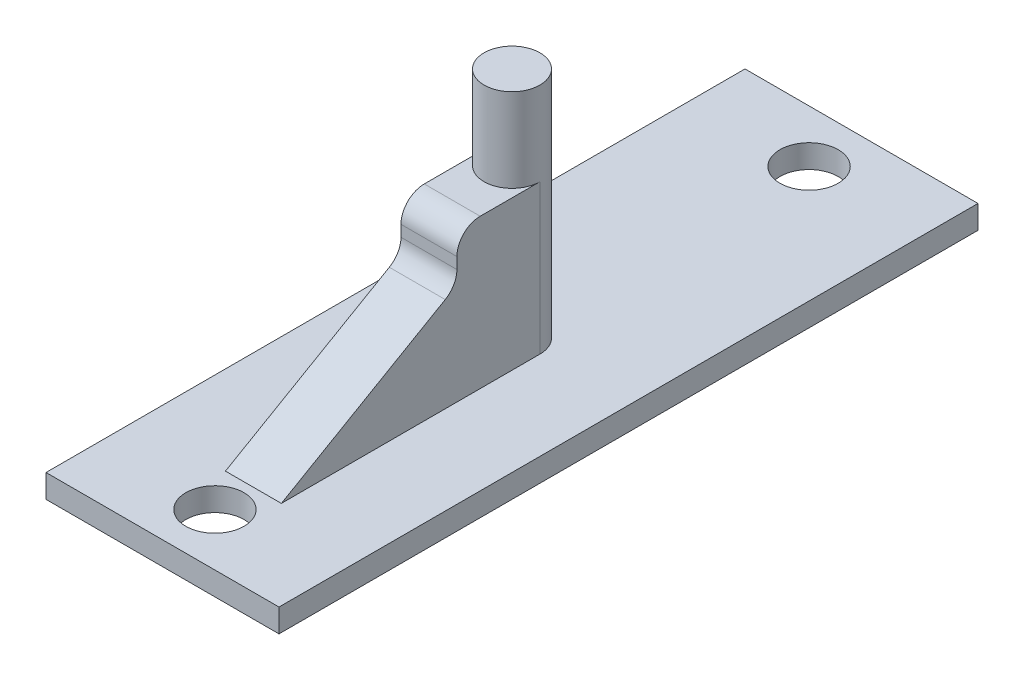
ISO-10303-21;
HEADER;
FILE_DESCRIPTION(('STEP AP214'),'2;1');
FILE_NAME('part.step','',(''),(''),'','','');
FILE_SCHEMA(('AUTOMOTIVE_DESIGN { 1 0 10303 214 1 1 1 1 }'));
ENDSEC;
DATA;
#1=APPLICATION_CONTEXT('core data for automotive mechanical design processes');
#2=APPLICATION_PROTOCOL_DEFINITION('international standard','automotive_design',2000,#1);
#3=PRODUCT_CONTEXT('',#1,'mechanical');
#4=PRODUCT('Part','Part','',(#3));
#5=PRODUCT_RELATED_PRODUCT_CATEGORY('part','',(#4));
#6=PRODUCT_DEFINITION_FORMATION('','',#4);
#7=PRODUCT_DEFINITION_CONTEXT('part definition',#1,'design');
#8=PRODUCT_DEFINITION('design','',#6,#7);
#9=PRODUCT_DEFINITION_SHAPE('','',#8);
#10=(LENGTH_UNIT() NAMED_UNIT(*) SI_UNIT(.MILLI.,.METRE.));
#11=(NAMED_UNIT(*) PLANE_ANGLE_UNIT() SI_UNIT($,.RADIAN.));
#12=(NAMED_UNIT(*) SI_UNIT($,.STERADIAN.) SOLID_ANGLE_UNIT());
#13=UNCERTAINTY_MEASURE_WITH_UNIT(LENGTH_MEASURE(1.E-05),#10,'distance_accuracy_value','');
#14=(GEOMETRIC_REPRESENTATION_CONTEXT(3) GLOBAL_UNCERTAINTY_ASSIGNED_CONTEXT((#13)) GLOBAL_UNIT_ASSIGNED_CONTEXT((#10,
#11,#12)) REPRESENTATION_CONTEXT('',''));
#15=CARTESIAN_POINT('',(0.,0.,0.));
#16=DIRECTION('',(0.,0.,1.));
#17=DIRECTION('',(1.,0.,0.));
#18=AXIS2_PLACEMENT_3D('',#15,#16,#17);
#19=CARTESIAN_POINT('',(0.,2.,0.));
#20=DIRECTION('',(0.,1.,0.));
#21=DIRECTION('',(0.,0.,1.));
#22=AXIS2_PLACEMENT_3D('',#19,#20,#21);
#23=PLANE('',#22);
#24=CARTESIAN_POINT('',(0.,2.,-25.5));
#25=DIRECTION('',(0.,1.,0.));
#26=DIRECTION('',(0.,0.,1.));
#27=AXIS2_PLACEMENT_3D('',#24,#25,#26);
#28=CIRCLE('',#27,2.5);
#29=CARTESIAN_POINT('',(0.,2.,-23.));
#30=VERTEX_POINT('',#29);
#31=EDGE_CURVE('E195',#30,#30,#28,.T.);
#32=ORIENTED_EDGE('',*,*,#31,.F.);
#33=EDGE_LOOP('',(#32));
#34=FACE_BOUND('',#33,.T.);
#35=CARTESIAN_POINT('',(0.,2.,25.5));
#36=DIRECTION('',(0.,1.,0.));
#37=DIRECTION('',(0.,0.,-1.));
#38=AXIS2_PLACEMENT_3D('',#35,#36,#37);
#39=CIRCLE('',#38,2.5);
#40=CARTESIAN_POINT('',(0.,2.,23.));
#41=VERTEX_POINT('',#40);
#42=EDGE_CURVE('E189',#41,#41,#39,.T.);
#43=ORIENTED_EDGE('',*,*,#42,.F.);
#44=EDGE_LOOP('',(#43));
#45=FACE_BOUND('',#44,.T.);
#46=DIRECTION('',(0.,0.,1.));
#47=VECTOR('',#46,1.);
#48=CARTESIAN_POINT('',(-10.,2.,-30.));
#49=LINE('',#48,#47);
#50=CARTESIAN_POINT('',(-10.,2.,-30.));
#51=VERTEX_POINT('',#50);
#52=CARTESIAN_POINT('',(-10.,2.,30.));
#53=VERTEX_POINT('',#52);
#54=EDGE_CURVE('E203',#51,#53,#49,.T.);
#55=ORIENTED_EDGE('',*,*,#54,.T.);
#56=DIRECTION('',(1.,0.,0.));
#57=VECTOR('',#56,1.);
#58=CARTESIAN_POINT('',(-10.,2.,30.));
#59=LINE('',#58,#57);
#60=CARTESIAN_POINT('',(10.,2.,30.));
#61=VERTEX_POINT('',#60);
#62=EDGE_CURVE('E206',#53,#61,#59,.T.);
#63=ORIENTED_EDGE('',*,*,#62,.T.);
#64=DIRECTION('',(0.,0.,-1.));
#65=VECTOR('',#64,1.);
#66=CARTESIAN_POINT('',(10.,2.,-30.));
#67=LINE('',#66,#65);
#68=CARTESIAN_POINT('',(10.,2.,-30.));
#69=VERTEX_POINT('',#68);
#70=EDGE_CURVE('E209',#61,#69,#67,.T.);
#71=ORIENTED_EDGE('',*,*,#70,.T.);
#72=DIRECTION('',(-1.,0.,0.));
#73=VECTOR('',#72,1.);
#74=CARTESIAN_POINT('',(-10.,2.,-30.));
#75=LINE('',#74,#73);
#76=EDGE_CURVE('E211',#69,#51,#75,.T.);
#77=ORIENTED_EDGE('',*,*,#76,.T.);
#78=EDGE_LOOP('',(#55,#63,#71,#77));
#79=FACE_BOUND('',#78,.T.);
#80=CARTESIAN_POINT('',(0.,2.,0.));
#81=DIRECTION('',(0.,1.,0.));
#82=DIRECTION('',(0.,0.,1.));
#83=AXIS2_PLACEMENT_3D('',#80,#81,#82);
#84=CIRCLE('',#83,2.4);
#85=CARTESIAN_POINT('',(2.4,2.,0.));
#86=VERTEX_POINT('',#85);
#87=CARTESIAN_POINT('',(-2.4,2.,0.));
#88=VERTEX_POINT('',#87);
#89=EDGE_CURVE('E181',#86,#88,#84,.T.);
#90=ORIENTED_EDGE('',*,*,#89,.F.);
#91=DIRECTION('',(0.,0.,1.));
#92=VECTOR('',#91,1.);
#93=CARTESIAN_POINT('',(2.4,2.,22.1964023040006));
#94=LINE('',#93,#92);
#95=CARTESIAN_POINT('',(2.4,2.,22.1964023040006));
#96=VERTEX_POINT('',#95);
#97=EDGE_CURVE('E62',#86,#96,#94,.T.);
#98=ORIENTED_EDGE('',*,*,#97,.T.);
#99=DIRECTION('',(-1.,0.,0.));
#100=VECTOR('',#99,1.);
#101=CARTESIAN_POINT('',(2.4,2.,22.1964023040006));
#102=LINE('',#101,#100);
#103=CARTESIAN_POINT('',(-2.4,2.,22.1964023040006));
#104=VERTEX_POINT('',#103);
#105=EDGE_CURVE('E66',#96,#104,#102,.T.);
#106=ORIENTED_EDGE('',*,*,#105,.T.);
#107=DIRECTION('',(0.,0.,1.));
#108=VECTOR('',#107,1.);
#109=CARTESIAN_POINT('',(-2.4,2.,22.1964023040006));
#110=LINE('',#109,#108);
#111=EDGE_CURVE('E166',#88,#104,#110,.T.);
#112=ORIENTED_EDGE('',*,*,#111,.F.);
#113=EDGE_LOOP('',(#90,#98,#106,#112));
#114=FACE_BOUND('',#113,.T.);
#115=ADVANCED_FACE('F41',(#34,#45,#79,#114),#23,.T.);
#116=CARTESIAN_POINT('',(-10.,2.,-30.));
#117=DIRECTION('',(1.,0.,0.));
#118=DIRECTION('',(0.,0.,-1.));
#119=AXIS2_PLACEMENT_3D('',#116,#117,#118);
#120=PLANE('',#119);
#121=DIRECTION('',(0.,0.,1.));
#122=VECTOR('',#121,1.);
#123=CARTESIAN_POINT('',(-10.,0.,-30.));
#124=LINE('',#123,#122);
#125=CARTESIAN_POINT('',(-10.,0.,-30.));
#126=VERTEX_POINT('',#125);
#127=CARTESIAN_POINT('',(-10.,0.,30.));
#128=VERTEX_POINT('',#127);
#129=EDGE_CURVE('E194',#126,#128,#124,.T.);
#130=ORIENTED_EDGE('',*,*,#129,.T.);
#131=DIRECTION('',(0.,-1.,0.));
#132=VECTOR('',#131,1.);
#133=CARTESIAN_POINT('',(-10.,2.,30.));
#134=LINE('',#133,#132);
#135=EDGE_CURVE('E55',#53,#128,#134,.T.);
#136=ORIENTED_EDGE('',*,*,#135,.F.);
#137=ORIENTED_EDGE('',*,*,#54,.F.);
#138=DIRECTION('',(0.,-1.,0.));
#139=VECTOR('',#138,1.);
#140=CARTESIAN_POINT('',(-10.,2.,-30.));
#141=LINE('',#140,#139);
#142=EDGE_CURVE('E213',#51,#126,#141,.T.);
#143=ORIENTED_EDGE('',*,*,#142,.T.);
#144=EDGE_LOOP('',(#130,#136,#137,#143));
#145=FACE_BOUND('',#144,.T.);
#146=ADVANCED_FACE('F43',(#145),#120,.F.);
#147=CARTESIAN_POINT('',(-10.,2.,30.));
#148=DIRECTION('',(0.,0.,-1.));
#149=DIRECTION('',(-1.,0.,0.));
#150=AXIS2_PLACEMENT_3D('',#147,#148,#149);
#151=PLANE('',#150);
#152=DIRECTION('',(1.,0.,0.));
#153=VECTOR('',#152,1.);
#154=CARTESIAN_POINT('',(-10.,0.,30.));
#155=LINE('',#154,#153);
#156=CARTESIAN_POINT('',(10.,0.,30.));
#157=VERTEX_POINT('',#156);
#158=EDGE_CURVE('E216',#128,#157,#155,.T.);
#159=ORIENTED_EDGE('',*,*,#158,.T.);
#160=DIRECTION('',(0.,-1.,0.));
#161=VECTOR('',#160,1.);
#162=CARTESIAN_POINT('',(10.,2.,30.));
#163=LINE('',#162,#161);
#164=EDGE_CURVE('E226',#61,#157,#163,.T.);
#165=ORIENTED_EDGE('',*,*,#164,.F.);
#166=ORIENTED_EDGE('',*,*,#62,.F.);
#167=ORIENTED_EDGE('',*,*,#135,.T.);
#168=EDGE_LOOP('',(#159,#165,#166,#167));
#169=FACE_BOUND('',#168,.T.);
#170=ADVANCED_FACE('F232',(#169),#151,.F.);
#171=CARTESIAN_POINT('',(10.,2.,-30.));
#172=DIRECTION('',(-1.,0.,0.));
#173=DIRECTION('',(0.,0.,1.));
#174=AXIS2_PLACEMENT_3D('',#171,#172,#173);
#175=PLANE('',#174);
#176=DIRECTION('',(0.,0.,-1.));
#177=VECTOR('',#176,1.);
#178=CARTESIAN_POINT('',(10.,0.,-30.));
#179=LINE('',#178,#177);
#180=CARTESIAN_POINT('',(10.,0.,-30.));
#181=VERTEX_POINT('',#180);
#182=EDGE_CURVE('E218',#157,#181,#179,.T.);
#183=ORIENTED_EDGE('',*,*,#182,.T.);
#184=DIRECTION('',(0.,-1.,0.));
#185=VECTOR('',#184,1.);
#186=CARTESIAN_POINT('',(10.,2.,-30.));
#187=LINE('',#186,#185);
#188=EDGE_CURVE('E223',#69,#181,#187,.T.);
#189=ORIENTED_EDGE('',*,*,#188,.F.);
#190=ORIENTED_EDGE('',*,*,#70,.F.);
#191=ORIENTED_EDGE('',*,*,#164,.T.);
#192=EDGE_LOOP('',(#183,#189,#190,#191));
#193=FACE_BOUND('',#192,.T.);
#194=ADVANCED_FACE('F244',(#193),#175,.F.);
#195=CARTESIAN_POINT('',(-10.,2.,-30.));
#196=DIRECTION('',(0.,0.,1.));
#197=DIRECTION('',(1.,0.,0.));
#198=AXIS2_PLACEMENT_3D('',#195,#196,#197);
#199=PLANE('',#198);
#200=DIRECTION('',(-1.,0.,0.));
#201=VECTOR('',#200,1.);
#202=CARTESIAN_POINT('',(-10.,0.,-30.));
#203=LINE('',#202,#201);
#204=EDGE_CURVE('E207',#181,#126,#203,.T.);
#205=ORIENTED_EDGE('',*,*,#204,.T.);
#206=ORIENTED_EDGE('',*,*,#142,.F.);
#207=ORIENTED_EDGE('',*,*,#76,.F.);
#208=ORIENTED_EDGE('',*,*,#188,.T.);
#209=EDGE_LOOP('',(#205,#206,#207,#208));
#210=FACE_BOUND('',#209,.T.);
#211=ADVANCED_FACE('F248',(#210),#199,.F.);
#212=CARTESIAN_POINT('',(0.,0.,0.));
#213=DIRECTION('',(0.,1.,0.));
#214=DIRECTION('',(0.,0.,1.));
#215=AXIS2_PLACEMENT_3D('',#212,#213,#214);
#216=PLANE('',#215);
#217=CARTESIAN_POINT('',(0.,0.,-25.5));
#218=DIRECTION('',(0.,1.,0.));
#219=DIRECTION('',(0.,0.,1.));
#220=AXIS2_PLACEMENT_3D('',#217,#218,#219);
#221=CIRCLE('',#220,2.5);
#222=CARTESIAN_POINT('',(0.,0.,-23.));
#223=VERTEX_POINT('',#222);
#224=EDGE_CURVE('E191',#223,#223,#221,.T.);
#225=ORIENTED_EDGE('',*,*,#224,.T.);
#226=EDGE_LOOP('',(#225));
#227=FACE_BOUND('',#226,.T.);
#228=CARTESIAN_POINT('',(0.,0.,25.5));
#229=DIRECTION('',(0.,1.,0.));
#230=DIRECTION('',(0.,0.,-1.));
#231=AXIS2_PLACEMENT_3D('',#228,#229,#230);
#232=CIRCLE('',#231,2.5);
#233=CARTESIAN_POINT('',(0.,0.,23.));
#234=VERTEX_POINT('',#233);
#235=EDGE_CURVE('E198',#234,#234,#232,.T.);
#236=ORIENTED_EDGE('',*,*,#235,.T.);
#237=EDGE_LOOP('',(#236));
#238=FACE_BOUND('',#237,.T.);
#239=ORIENTED_EDGE('',*,*,#129,.F.);
#240=ORIENTED_EDGE('',*,*,#204,.F.);
#241=ORIENTED_EDGE('',*,*,#182,.F.);
#242=ORIENTED_EDGE('',*,*,#158,.F.);
#243=EDGE_LOOP('',(#239,#240,#241,#242));
#244=FACE_BOUND('',#243,.T.);
#245=ADVANCED_FACE('F240',(#227,#238,#244),#216,.F.);
#246=CARTESIAN_POINT('',(0.,0.,25.5));
#247=DIRECTION('',(0.,1.,0.));
#248=DIRECTION('',(0.,0.,1.));
#249=AXIS2_PLACEMENT_3D('',#246,#247,#248);
#250=CYLINDRICAL_SURFACE('',#249,2.5);
#251=ORIENTED_EDGE('',*,*,#235,.F.);
#252=EDGE_LOOP('',(#251));
#253=FACE_BOUND('',#252,.T.);
#254=ORIENTED_EDGE('',*,*,#42,.T.);
#255=EDGE_LOOP('',(#254));
#256=FACE_BOUND('',#255,.T.);
#257=ADVANCED_FACE('F311',(#253,#256),#250,.F.);
#258=CARTESIAN_POINT('',(0.,0.,-25.5));
#259=DIRECTION('',(0.,1.,0.));
#260=DIRECTION('',(0.,0.,1.));
#261=AXIS2_PLACEMENT_3D('',#258,#259,#260);
#262=CYLINDRICAL_SURFACE('',#261,2.5);
#263=ORIENTED_EDGE('',*,*,#224,.F.);
#264=EDGE_LOOP('',(#263));
#265=FACE_BOUND('',#264,.T.);
#266=ORIENTED_EDGE('',*,*,#31,.T.);
#267=EDGE_LOOP('',(#266));
#268=FACE_BOUND('',#267,.T.);
#269=ADVANCED_FACE('F308',(#265,#268),#262,.F.);
#270=CARTESIAN_POINT('',(0.,22.,0.));
#271=DIRECTION('',(0.,-1.,0.));
#272=DIRECTION('',(0.,0.,-1.));
#273=AXIS2_PLACEMENT_3D('',#270,#271,#272);
#274=CYLINDRICAL_SURFACE('',#273,2.4);
#275=CARTESIAN_POINT('',(0.,21.8,-2.4));
#276=CARTESIAN_POINT('',(-0.0277636166806641,21.7999990090123,-2.3999994861066));
#277=CARTESIAN_POINT('',(-0.0555395158083497,21.7976797337125,-2.39951331510017));
#278=CARTESIAN_POINT('',(-0.110304526506797,21.7884722601869,-2.39762080396272));
#279=CARTESIAN_POINT('',(-0.137293024051325,21.7815805907852,-2.39621376475699));
#280=CARTESIAN_POINT('',(-0.189683652916537,21.7634518180313,-2.39263643678481));
#281=CARTESIAN_POINT('',(-0.215087334683674,21.7522190416004,-2.39046690821058));
#282=CARTESIAN_POINT('',(-0.263648131442383,21.7257401564575,-2.38559971123943));
#283=CARTESIAN_POINT('',(-0.28680534701373,21.7104942275377,-2.3829020665039));
#284=CARTESIAN_POINT('',(-0.330556129723534,21.6761854639237,-2.3772308000986));
#285=CARTESIAN_POINT('',(-0.351112097665074,21.657075199506,-2.37425402339412));
#286=CARTESIAN_POINT('',(-0.388751110707757,21.615682136322,-2.36838263076979));
#287=CARTESIAN_POINT('',(-0.405833868384396,21.5933990752511,-2.36548802166673));
#288=CARTESIAN_POINT('',(-0.436204126708867,21.5460192124935,-2.36007777038123));
#289=CARTESIAN_POINT('',(-0.449452218722603,21.5208966461989,-2.35756618069931));
#290=CARTESIAN_POINT('',(-0.471524477392254,21.4687210192909,-2.35325136260008));
#291=CARTESIAN_POINT('',(-0.480349120670565,21.441668167023,-2.35144805787027));
#292=CARTESIAN_POINT('',(-0.493200960534948,21.3868059050337,-2.34878600394449));
#293=CARTESIAN_POINT('',(-0.497294390787196,21.3590126562661,-2.34791422742346));
#294=CARTESIAN_POINT('',(-0.500773430622459,21.3031212628549,-2.34717476286596));
#295=CARTESIAN_POINT('',(-0.500159563578747,21.2750231524539,-2.34730696320392));
#296=CARTESIAN_POINT('',(-0.494294876148789,21.2198075888099,-2.3485486972767));
#297=CARTESIAN_POINT('',(-0.489120420930882,21.1926816081355,-2.3496421347196));
#298=CARTESIAN_POINT('',(-0.474402174119781,21.139691396142,-2.35265775046377));
#299=CARTESIAN_POINT('',(-0.464858157925528,21.1138272297575,-2.35457997136527));
#300=CARTESIAN_POINT('',(-0.441600012855714,21.0638771086336,-2.35905276585641));
#301=CARTESIAN_POINT('',(-0.427856010136947,21.0398054813892,-2.36160781514234));
#302=CARTESIAN_POINT('',(-0.396609079709927,20.9942817022927,-2.36705556004288));
#303=CARTESIAN_POINT('',(-0.379105684905036,20.9728298764656,-2.36994829759415));
#304=CARTESIAN_POINT('',(-0.340429968618714,20.9327144155679,-2.37581492371963));
#305=CARTESIAN_POINT('',(-0.319192573364833,20.9141135324412,-2.37878929279789));
#306=CARTESIAN_POINT('',(-0.273866915444719,20.8807278231084,-2.384432352572));
#307=CARTESIAN_POINT('',(-0.249778610010306,20.8659430541606,-2.38710103868094));
#308=CARTESIAN_POINT('',(-0.199362216494191,20.8405959673856,-2.39183948377126));
#309=CARTESIAN_POINT('',(-0.1730301847706,20.8300412781732,-2.39390815884103));
#310=CARTESIAN_POINT('',(-0.118913848388863,20.8135233180658,-2.39720535284512));
#311=CARTESIAN_POINT('',(-0.0911297354380366,20.8075594427074,-2.39843398238421));
#312=CARTESIAN_POINT('',(-0.0354367462803351,20.8004822991728,-2.39989710086182));
#313=CARTESIAN_POINT('',(-0.00753922221047254,20.7992832234023,-2.40014917415031));
#314=CARTESIAN_POINT('',(0.0480575195030849,20.8015379799876,-2.39967980901109));
#315=CARTESIAN_POINT('',(0.0757567491849025,20.8049915274406,-2.39895843019261));
#316=CARTESIAN_POINT('',(0.129890546847925,20.8163822613878,-2.39663425991673));
#317=CARTESIAN_POINT('',(0.156334877157682,20.8242749941534,-2.39504021147231));
#318=CARTESIAN_POINT('',(0.207524578664532,20.8442711441686,-2.39114890896958));
#319=CARTESIAN_POINT('',(0.23226981453471,20.8563748963464,-2.38885159897831));
#320=CARTESIAN_POINT('',(0.279717722777397,20.884632151295,-2.38376496596285));
#321=CARTESIAN_POINT('',(0.302389287787932,20.9008367718276,-2.38096957524932));
#322=CARTESIAN_POINT('',(0.344722178354607,20.9367678252305,-2.37521027319883));
#323=CARTESIAN_POINT('',(0.364383151165314,20.9564946702076,-2.37224634217004));
#324=CARTESIAN_POINT('',(0.40047145946072,20.9993022307999,-2.36642409812551));
#325=CARTESIAN_POINT('',(0.416839658400817,21.0224332127821,-2.36356835723));
#326=CARTESIAN_POINT('',(0.445458876316974,21.0711665136855,-2.35834240406322));
#327=CARTESIAN_POINT('',(0.457710066711456,21.0967687296556,-2.3559721715786));
#328=CARTESIAN_POINT('',(0.477668985775689,21.1495844785193,-2.35200680283216));
#329=CARTESIAN_POINT('',(0.485401239312127,21.1767884148663,-2.35040749113875));
#330=CARTESIAN_POINT('',(0.49617615409363,21.2321466201969,-2.34815673883879));
#331=CARTESIAN_POINT('',(0.499219486177764,21.2603007526478,-2.34750516264147));
#332=CARTESIAN_POINT('',(0.500503705950446,21.3161653603999,-2.34723162923402));
#333=CARTESIAN_POINT('',(0.498838170490902,21.3438736280888,-2.34758960928601));
#334=CARTESIAN_POINT('',(0.490959621256128,21.3986056035681,-2.34924978901971));
#335=CARTESIAN_POINT('',(0.484746651129066,21.4256293179264,-2.3505519796385));
#336=CARTESIAN_POINT('',(0.467992871074341,21.4781591087563,-2.35394452979086));
#337=CARTESIAN_POINT('',(0.457464470273686,21.5036692985948,-2.35603262803172));
#338=CARTESIAN_POINT('',(0.432389829199029,21.5525755104107,-2.36076282295495));
#339=CARTESIAN_POINT('',(0.41784321593212,21.5759713358533,-2.36340497106184));
#340=CARTESIAN_POINT('',(0.384829478136964,21.6204486508318,-2.36900631820458));
#341=CARTESIAN_POINT('',(0.366295156167291,21.641479649826,-2.37197045547362));
#342=CARTESIAN_POINT('',(0.325969775246134,21.6801637972905,-2.37784735833285));
#343=CARTESIAN_POINT('',(0.304177967533188,21.6978161670206,-2.38076011193952));
#344=CARTESIAN_POINT('',(0.257653771003082,21.7294354292736,-2.38624577819055));
#345=CARTESIAN_POINT('',(0.232890368608541,21.7433574719545,-2.38881438429298));
#346=CARTESIAN_POINT('',(0.181327937599383,21.766820091372,-2.39327963397637));
#347=CARTESIAN_POINT('',(0.154530712762899,21.7763644988728,-2.3951768647284));
#348=CARTESIAN_POINT('',(0.106406117160043,21.7890161113154,-2.39772999912577));
#349=CARTESIAN_POINT('',(0.0853470374911725,21.7931275052835,-2.39857614264558));
#350=CARTESIAN_POINT('',(0.0428610696706153,21.7986197817109,-2.39971133115903));
#351=CARTESIAN_POINT('',(0.0214341951395489,21.8000007650669,-2.40000039673834));
#352=CARTESIAN_POINT('',(0.,21.8,-2.4));
#353=B_SPLINE_CURVE_WITH_KNOTS('',3,(#275,#276,#277,#278,#279,#280,#281,#282,#283,#284,#285,
#286,#287,#288,#289,#290,#291,#292,#293,#294,#295,#296,#297,#298,#299,#300,#301,#302,#303,#304,
#305,#306,#307,#308,#309,#310,#311,#312,#313,#314,#315,#316,#317,#318,#319,#320,#321,#322,#323,
#324,#325,#326,#327,#328,#329,#330,#331,#332,#333,#334,#335,#336,#337,#338,#339,#340,#341,#342,
#343,#344,#345,#346,#347,#348,#349,#350,#351,#352),.UNSPECIFIED.,.T.,.F.,(4,2,2,2,2,2,2,2,2,2,2,
2,2,2,2,2,2,2,2,2,2,2,2,2,2,2,2,2,2,2,2,2,2,2,2,2,2,2,4),(0.,0.0832124180412729,
0.166488079962489,0.249680951530179,0.332870096629195,0.417150105552491,0.501437086207141,
0.58656179671419,0.67167733314196,0.75558630067942,0.839485939068659,0.922006848516241,
1.00453200012112,1.087658369667,1.17079507347214,1.25555810542186,1.34032240911287,
1.42523889799865,1.51014420418309,1.5935133576307,1.67687740620911,1.75942114653049,
1.84197145356373,1.92560633598294,2.0092510102583,2.09428505531735,2.17931555940524,
2.2638802003801,2.34843274165674,2.43131689316415,2.51420024912544,2.59684692557302,
2.67950127632592,2.76367609932124,2.84787030046948,2.93303545759303,3.0181259458599,
3.08237035390912,3.14661238789357),.UNSPECIFIED.);
#354=CARTESIAN_POINT('',(0.,21.8,-2.4));
#355=VERTEX_POINT('',#354);
#356=EDGE_CURVE('E45',#355,#355,#353,.T.);
#357=ORIENTED_EDGE('',*,*,#356,.T.);
#358=EDGE_LOOP('',(#357));
#359=FACE_BOUND('',#358,.T.);
#360=CARTESIAN_POINT('',(0.,22.,0.));
#361=DIRECTION('',(0.,1.,0.));
#362=DIRECTION('',(0.,0.,1.));
#363=AXIS2_PLACEMENT_3D('',#360,#361,#362);
#364=CIRCLE('',#363,2.4);
#365=CARTESIAN_POINT('',(0.,22.,2.4));
#366=VERTEX_POINT('',#365);
#367=EDGE_CURVE('E186',#366,#366,#364,.T.);
#368=ORIENTED_EDGE('',*,*,#367,.F.);
#369=EDGE_LOOP('',(#368));
#370=FACE_BOUND('',#369,.T.);
#371=CARTESIAN_POINT('',(0.,14.815098845256,0.));
#372=DIRECTION('',(0.,1.,0.));
#373=DIRECTION('',(0.,0.,1.));
#374=AXIS2_PLACEMENT_3D('',#371,#372,#373);
#375=CIRCLE('',#374,2.4);
#376=CARTESIAN_POINT('',(-2.4,14.815098845256,0.));
#377=VERTEX_POINT('',#376);
#378=CARTESIAN_POINT('',(2.4,14.815098845256,0.));
#379=VERTEX_POINT('',#378);
#380=EDGE_CURVE('E11',#377,#379,#375,.T.);
#381=ORIENTED_EDGE('',*,*,#380,.T.);
#382=DIRECTION('',(0.,-1.,0.));
#383=VECTOR('',#382,1.);
#384=CARTESIAN_POINT('',(2.4,2.,0.));
#385=LINE('',#384,#383);
#386=EDGE_CURVE('E152',#379,#86,#385,.T.);
#387=ORIENTED_EDGE('',*,*,#386,.T.);
#388=ORIENTED_EDGE('',*,*,#89,.T.);
#389=DIRECTION('',(0.,-1.,0.));
#390=VECTOR('',#389,1.);
#391=CARTESIAN_POINT('',(-2.4,2.,0.));
#392=LINE('',#391,#390);
#393=EDGE_CURVE('E163',#377,#88,#392,.T.);
#394=ORIENTED_EDGE('',*,*,#393,.F.);
#395=EDGE_LOOP('',(#381,#387,#388,#394));
#396=FACE_BOUND('',#395,.T.);
#397=ADVANCED_FACE('F269',(#359,#370,#396),#274,.T.);
#398=CARTESIAN_POINT('',(0.,22.,0.));
#399=DIRECTION('',(0.,1.,0.));
#400=DIRECTION('',(0.,0.,1.));
#401=AXIS2_PLACEMENT_3D('',#398,#399,#400);
#402=PLANE('',#401);
#403=ORIENTED_EDGE('',*,*,#367,.T.);
#404=EDGE_LOOP('',(#403));
#405=FACE_BOUND('',#404,.T.);
#406=ADVANCED_FACE('F302',(#405),#402,.T.);
#407=CARTESIAN_POINT('',(2.4,14.815098845256,0.));
#408=DIRECTION('',(0.,1.,0.));
#409=DIRECTION('',(0.,0.,1.));
#410=AXIS2_PLACEMENT_3D('',#407,#408,#409);
#411=PLANE('',#410);
#412=ORIENTED_EDGE('',*,*,#380,.F.);
#413=DIRECTION('',(0.,0.,-1.));
#414=VECTOR('',#413,1.);
#415=CARTESIAN_POINT('',(-2.4,14.815098845256,0.));
#416=LINE('',#415,#414);
#417=CARTESIAN_POINT('',(-2.4,14.815098845256,5.13084577541422));
#418=VERTEX_POINT('',#417);
#419=EDGE_CURVE('E160',#418,#377,#416,.T.);
#420=ORIENTED_EDGE('',*,*,#419,.F.);
#421=DIRECTION('',(-1.,0.,0.));
#422=VECTOR('',#421,1.);
#423=CARTESIAN_POINT('',(2.4,14.815098845256,5.13084577541422));
#424=LINE('',#423,#422);
#425=CARTESIAN_POINT('',(2.4,14.815098845256,5.13084577541422));
#426=VERTEX_POINT('',#425);
#427=EDGE_CURVE('E179',#426,#418,#424,.T.);
#428=ORIENTED_EDGE('',*,*,#427,.F.);
#429=DIRECTION('',(0.,0.,-1.));
#430=VECTOR('',#429,1.);
#431=CARTESIAN_POINT('',(2.4,14.815098845256,0.));
#432=LINE('',#431,#430);
#433=EDGE_CURVE('E178',#426,#379,#432,.T.);
#434=ORIENTED_EDGE('',*,*,#433,.T.);
#435=EDGE_LOOP('',(#412,#420,#428,#434));
#436=FACE_BOUND('',#435,.T.);
#437=ADVANCED_FACE('F258',(#436),#411,.T.);
#438=CARTESIAN_POINT('',(2.4,12.815098845256,5.13084577541423));
#439=DIRECTION('',(-1.,0.,0.));
#440=DIRECTION('',(0.,0.,1.));
#441=AXIS2_PLACEMENT_3D('',#438,#439,#440);
#442=CYLINDRICAL_SURFACE('',#441,2.);
#443=CARTESIAN_POINT('',(-2.4,12.815098845256,5.13084577541423));
#444=DIRECTION('',(-1.,0.,0.));
#445=DIRECTION('',(0.,0.,1.));
#446=AXIS2_PLACEMENT_3D('',#443,#444,#445);
#447=CIRCLE('',#446,2.);
#448=CARTESIAN_POINT('',(-2.4,12.815098845256,7.13084577541423));
#449=VERTEX_POINT('',#448);
#450=EDGE_CURVE('E175',#449,#418,#447,.T.);
#451=ORIENTED_EDGE('',*,*,#450,.F.);
#452=DIRECTION('',(-1.,0.,0.));
#453=VECTOR('',#452,1.);
#454=CARTESIAN_POINT('',(2.4,12.815098845256,7.13084577541423));
#455=LINE('',#454,#453);
#456=CARTESIAN_POINT('',(2.4,12.815098845256,7.13084577541423));
#457=VERTEX_POINT('',#456);
#458=EDGE_CURVE('E182',#457,#449,#455,.T.);
#459=ORIENTED_EDGE('',*,*,#458,.F.);
#460=CARTESIAN_POINT('',(2.4,12.815098845256,5.13084577541423));
#461=DIRECTION('',(-1.,0.,0.));
#462=DIRECTION('',(0.,0.,1.));
#463=AXIS2_PLACEMENT_3D('',#460,#461,#462);
#464=CIRCLE('',#463,2.);
#465=EDGE_CURVE('E157',#457,#426,#464,.T.);
#466=ORIENTED_EDGE('',*,*,#465,.T.);
#467=ORIENTED_EDGE('',*,*,#427,.T.);
#468=EDGE_LOOP('',(#451,#459,#466,#467));
#469=FACE_BOUND('',#468,.T.);
#470=ADVANCED_FACE('F288',(#469),#442,.T.);
#471=CARTESIAN_POINT('',(2.4,12.815098845256,7.13084577541423));
#472=DIRECTION('',(0.,0.,1.));
#473=DIRECTION('',(1.,0.,0.));
#474=AXIS2_PLACEMENT_3D('',#471,#472,#473);
#475=PLANE('',#474);
#476=DIRECTION('',(0.,1.,0.));
#477=VECTOR('',#476,1.);
#478=CARTESIAN_POINT('',(-2.4,12.815098845256,7.13084577541423));
#479=LINE('',#478,#477);
#480=CARTESIAN_POINT('',(-2.4,11.8528036556501,7.13084577541423));
#481=VERTEX_POINT('',#480);
#482=EDGE_CURVE('E172',#481,#449,#479,.T.);
#483=ORIENTED_EDGE('',*,*,#482,.F.);
#484=DIRECTION('',(-1.,0.,0.));
#485=VECTOR('',#484,1.);
#486=CARTESIAN_POINT('',(2.4,11.8528036556501,7.13084577541423));
#487=LINE('',#486,#485);
#488=CARTESIAN_POINT('',(2.4,11.8528036556501,7.13084577541423));
#489=VERTEX_POINT('',#488);
#490=EDGE_CURVE('E138',#489,#481,#487,.T.);
#491=ORIENTED_EDGE('',*,*,#490,.F.);
#492=DIRECTION('',(0.,1.,0.));
#493=VECTOR('',#492,1.);
#494=CARTESIAN_POINT('',(2.4,12.815098845256,7.13084577541423));
#495=LINE('',#494,#493);
#496=EDGE_CURVE('E148',#489,#457,#495,.T.);
#497=ORIENTED_EDGE('',*,*,#496,.T.);
#498=ORIENTED_EDGE('',*,*,#458,.T.);
#499=EDGE_LOOP('',(#483,#491,#497,#498));
#500=FACE_BOUND('',#499,.T.);
#501=ADVANCED_FACE('F291',(#500),#475,.T.);
#502=CARTESIAN_POINT('',(2.4,11.8528036556501,9.13084577541423));
#503=DIRECTION('',(-1.,0.,0.));
#504=DIRECTION('',(0.,0.,1.));
#505=AXIS2_PLACEMENT_3D('',#502,#503,#504);
#506=CYLINDRICAL_SURFACE('',#505,2.);
#507=CARTESIAN_POINT('',(-2.4,11.8528036556501,9.13084577541423));
#508=DIRECTION('',(1.,0.,0.));
#509=DIRECTION('',(0.,0.,-1.));
#510=AXIS2_PLACEMENT_3D('',#507,#508,#509);
#511=CIRCLE('',#510,2.);
#512=CARTESIAN_POINT('',(-2.4,10.1207528480813,8.13084577541423));
#513=VERTEX_POINT('',#512);
#514=EDGE_CURVE('E134',#513,#481,#511,.T.);
#515=ORIENTED_EDGE('',*,*,#514,.F.);
#516=DIRECTION('',(-1.,0.,0.));
#517=VECTOR('',#516,1.);
#518=CARTESIAN_POINT('',(2.4,10.1207528480813,8.13084577541423));
#519=LINE('',#518,#517);
#520=CARTESIAN_POINT('',(2.4,10.1207528480813,8.13084577541423));
#521=VERTEX_POINT('',#520);
#522=EDGE_CURVE('E129',#521,#513,#519,.T.);
#523=ORIENTED_EDGE('',*,*,#522,.F.);
#524=CARTESIAN_POINT('',(2.4,11.8528036556501,9.13084577541423));
#525=DIRECTION('',(1.,0.,0.));
#526=DIRECTION('',(0.,0.,-1.));
#527=AXIS2_PLACEMENT_3D('',#524,#525,#526);
#528=CIRCLE('',#527,2.);
#529=EDGE_CURVE('E132',#521,#489,#528,.T.);
#530=ORIENTED_EDGE('',*,*,#529,.T.);
#531=ORIENTED_EDGE('',*,*,#490,.T.);
#532=EDGE_LOOP('',(#515,#523,#530,#531));
#533=FACE_BOUND('',#532,.T.);
#534=ADVANCED_FACE('F131',(#533),#506,.F.);
#535=CARTESIAN_POINT('',(2.4,10.1207528480813,8.13084577541423));
#536=DIRECTION('',(0.,0.866025403784438,0.500000000000001));
#537=DIRECTION('',(0.,-0.500000000000001,0.866025403784438));
#538=AXIS2_PLACEMENT_3D('',#535,#536,#537);
#539=PLANE('',#538);
#540=DIRECTION('',(0.,0.500000000000001,-0.866025403784438));
#541=VECTOR('',#540,1.);
#542=CARTESIAN_POINT('',(-2.4,10.1207528480813,8.13084577541423));
#543=LINE('',#542,#541);
#544=EDGE_CURVE('E169',#104,#513,#543,.T.);
#545=ORIENTED_EDGE('',*,*,#544,.F.);
#546=ORIENTED_EDGE('',*,*,#105,.F.);
#547=DIRECTION('',(0.,0.500000000000001,-0.866025403784438));
#548=VECTOR('',#547,1.);
#549=CARTESIAN_POINT('',(2.4,10.1207528480813,8.13084577541423));
#550=LINE('',#549,#548);
#551=EDGE_CURVE('E145',#96,#521,#550,.T.);
#552=ORIENTED_EDGE('',*,*,#551,.T.);
#553=ORIENTED_EDGE('',*,*,#522,.T.);
#554=EDGE_LOOP('',(#545,#546,#552,#553));
#555=FACE_BOUND('',#554,.T.);
#556=ADVANCED_FACE('F150',(#555),#539,.T.);
#557=CARTESIAN_POINT('',(2.4,12.815098845256,5.13084577541423));
#558=DIRECTION('',(-1.,0.,0.));
#559=DIRECTION('',(0.,0.,1.));
#560=AXIS2_PLACEMENT_3D('',#557,#558,#559);
#561=PLANE('',#560);
#562=ORIENTED_EDGE('',*,*,#433,.F.);
#563=ORIENTED_EDGE('',*,*,#465,.F.);
#564=ORIENTED_EDGE('',*,*,#496,.F.);
#565=ORIENTED_EDGE('',*,*,#529,.F.);
#566=ORIENTED_EDGE('',*,*,#551,.F.);
#567=ORIENTED_EDGE('',*,*,#97,.F.);
#568=ORIENTED_EDGE('',*,*,#386,.F.);
#569=EDGE_LOOP('',(#562,#563,#564,#565,#566,#567,#568));
#570=FACE_BOUND('',#569,.T.);
#571=ADVANCED_FACE('F144',(#570),#561,.F.);
#572=CARTESIAN_POINT('',(-2.4,12.815098845256,5.13084577541423));
#573=DIRECTION('',(-1.,0.,0.));
#574=DIRECTION('',(0.,0.,1.));
#575=AXIS2_PLACEMENT_3D('',#572,#573,#574);
#576=PLANE('',#575);
#577=ORIENTED_EDGE('',*,*,#419,.T.);
#578=ORIENTED_EDGE('',*,*,#393,.T.);
#579=ORIENTED_EDGE('',*,*,#111,.T.);
#580=ORIENTED_EDGE('',*,*,#544,.T.);
#581=ORIENTED_EDGE('',*,*,#514,.T.);
#582=ORIENTED_EDGE('',*,*,#482,.T.);
#583=ORIENTED_EDGE('',*,*,#450,.T.);
#584=EDGE_LOOP('',(#577,#578,#579,#580,#581,#582,#583));
#585=FACE_BOUND('',#584,.T.);
#586=ADVANCED_FACE('F275',(#585),#576,.T.);
#587=CARTESIAN_POINT('',(0.,21.3,-3.));
#588=DIRECTION('',(0.,0.,1.));
#589=DIRECTION('',(1.,0.,0.));
#590=AXIS2_PLACEMENT_3D('',#587,#588,#589);
#591=CYLINDRICAL_SURFACE('',#590,0.5);
#592=CARTESIAN_POINT('',(0.,21.3,-1.));
#593=DIRECTION('',(0.,0.,1.));
#594=DIRECTION('',(1.,0.,0.));
#595=AXIS2_PLACEMENT_3D('',#592,#593,#594);
#596=CIRCLE('',#595,0.5);
#597=CARTESIAN_POINT('',(0.5,21.3,-1.));
#598=VERTEX_POINT('',#597);
#599=EDGE_CURVE('E262',#598,#598,#596,.T.);
#600=ORIENTED_EDGE('',*,*,#599,.T.);
#601=EDGE_LOOP('',(#600));
#602=FACE_BOUND('',#601,.T.);
#603=ORIENTED_EDGE('',*,*,#356,.F.);
#604=EDGE_LOOP('',(#603));
#605=FACE_BOUND('',#604,.T.);
#606=ADVANCED_FACE('F272',(#602,#605),#591,.F.);
#607=CARTESIAN_POINT('',(0.,21.3,-1.));
#608=DIRECTION('',(0.,0.,1.));
#609=DIRECTION('',(1.,0.,0.));
#610=AXIS2_PLACEMENT_3D('',#607,#608,#609);
#611=PLANE('',#610);
#612=ORIENTED_EDGE('',*,*,#599,.F.);
#613=EDGE_LOOP('',(#612));
#614=FACE_BOUND('',#613,.T.);
#615=ADVANCED_FACE('F274',(#614),#611,.F.);
#616=CLOSED_SHELL('',(#115,#146,#170,#194,#211,#245,#257,#269,#397,#406,#437,#470,#501,#534,
#556,#571,#586,#606,#615));
#617=MANIFOLD_SOLID_BREP('B2',#616);
#618=ADVANCED_BREP_SHAPE_REPRESENTATION('',(#18,#617),#14);
#619=SHAPE_DEFINITION_REPRESENTATION(#9,#618);
ENDSEC;
END-ISO-10303-21;
